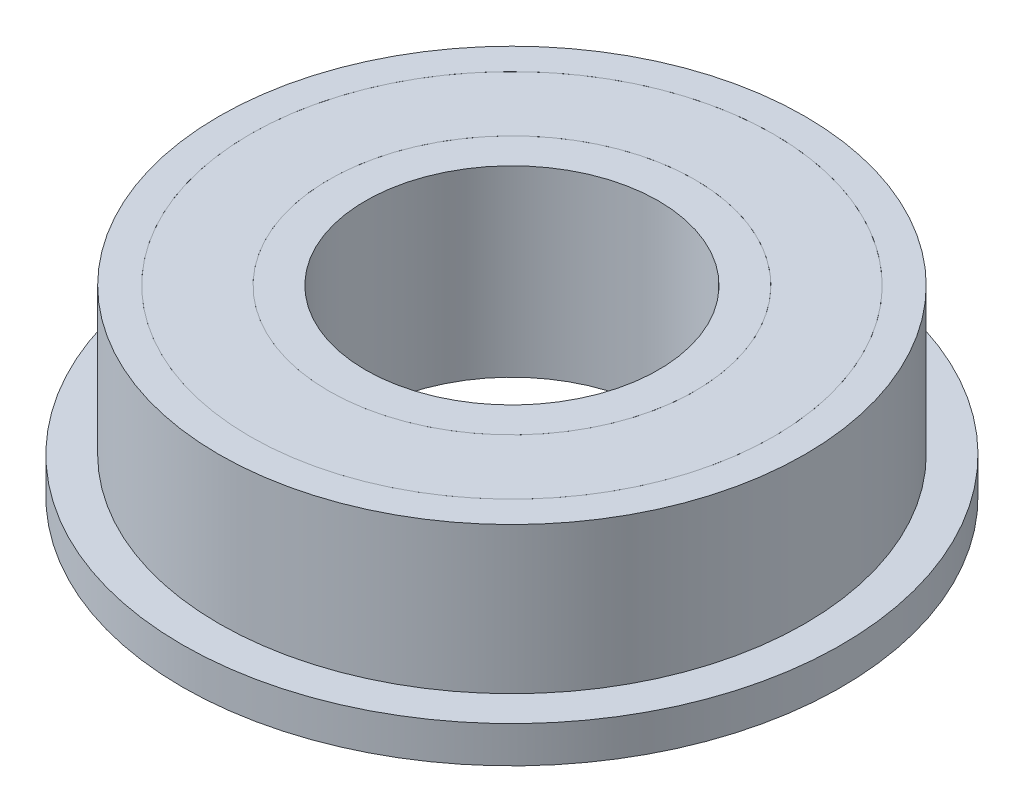
ISO-10303-21;
HEADER;
FILE_DESCRIPTION(('STEP AP214'),'2;1');
FILE_NAME('part.step','',(''),(''),'','','');
FILE_SCHEMA(('AUTOMOTIVE_DESIGN { 1 0 10303 214 1 1 1 1 }'));
ENDSEC;
DATA;
#1=APPLICATION_CONTEXT('core data for automotive mechanical design processes');
#2=APPLICATION_PROTOCOL_DEFINITION('international standard','automotive_design',2000,#1);
#3=PRODUCT_CONTEXT('',#1,'mechanical');
#4=PRODUCT('Part','Part','',(#3));
#5=PRODUCT_RELATED_PRODUCT_CATEGORY('part','',(#4));
#6=PRODUCT_DEFINITION_FORMATION('','',#4);
#7=PRODUCT_DEFINITION_CONTEXT('part definition',#1,'design');
#8=PRODUCT_DEFINITION('design','',#6,#7);
#9=PRODUCT_DEFINITION_SHAPE('','',#8);
#10=(LENGTH_UNIT() NAMED_UNIT(*) SI_UNIT(.MILLI.,.METRE.));
#11=(NAMED_UNIT(*) PLANE_ANGLE_UNIT() SI_UNIT($,.RADIAN.));
#12=(NAMED_UNIT(*) SI_UNIT($,.STERADIAN.) SOLID_ANGLE_UNIT());
#13=UNCERTAINTY_MEASURE_WITH_UNIT(LENGTH_MEASURE(1.E-05),#10,'distance_accuracy_value','');
#14=(GEOMETRIC_REPRESENTATION_CONTEXT(3) GLOBAL_UNCERTAINTY_ASSIGNED_CONTEXT((#13)) GLOBAL_UNIT_ASSIGNED_CONTEXT((#10,
#11,#12)) REPRESENTATION_CONTEXT('',''));
#15=CARTESIAN_POINT('',(0.,0.,0.));
#16=DIRECTION('',(0.,0.,1.));
#17=DIRECTION('',(1.,0.,0.));
#18=AXIS2_PLACEMENT_3D('',#15,#16,#17);
#19=CARTESIAN_POINT('',(0.,5.,0.));
#20=DIRECTION('',(0.,1.,0.));
#21=DIRECTION('',(0.,0.,1.));
#22=AXIS2_PLACEMENT_3D('',#19,#20,#21);
#23=PLANE('',#22);
#24=CARTESIAN_POINT('',(0.,5.,0.));
#25=DIRECTION('',(0.,1.,0.));
#26=DIRECTION('',(0.,0.,1.));
#27=AXIS2_PLACEMENT_3D('',#24,#25,#26);
#28=CIRCLE('',#27,4.);
#29=CARTESIAN_POINT('',(0.,5.,4.));
#30=VERTEX_POINT('',#29);
#31=EDGE_CURVE('E65',#30,#30,#28,.T.);
#32=ORIENTED_EDGE('',*,*,#31,.F.);
#33=EDGE_LOOP('',(#32));
#34=FACE_BOUND('',#33,.T.);
#35=CARTESIAN_POINT('',(0.,5.,0.));
#36=DIRECTION('',(0.,1.,0.));
#37=DIRECTION('',(0.,0.,1.));
#38=AXIS2_PLACEMENT_3D('',#35,#36,#37);
#39=CIRCLE('',#38,5.);
#40=CARTESIAN_POINT('',(0.,5.,5.));
#41=VERTEX_POINT('',#40);
#42=EDGE_CURVE('E11',#41,#41,#39,.F.);
#43=ORIENTED_EDGE('',*,*,#42,.F.);
#44=EDGE_LOOP('',(#43));
#45=FACE_BOUND('',#44,.T.);
#46=ADVANCED_FACE('F52',(#34,#45),#23,.T.);
#47=CARTESIAN_POINT('',(0.,0.,0.));
#48=DIRECTION('',(0.,-1.,0.));
#49=DIRECTION('',(0.,0.,-1.));
#50=AXIS2_PLACEMENT_3D('',#47,#48,#49);
#51=PLANE('',#50);
#52=CARTESIAN_POINT('',(0.,0.,0.));
#53=DIRECTION('',(0.,-1.,0.));
#54=DIRECTION('',(0.,0.,-1.));
#55=AXIS2_PLACEMENT_3D('',#52,#53,#54);
#56=CIRCLE('',#55,4.);
#57=CARTESIAN_POINT('',(0.,0.,-4.));
#58=VERTEX_POINT('',#57);
#59=EDGE_CURVE('E55',#58,#58,#56,.T.);
#60=ORIENTED_EDGE('',*,*,#59,.F.);
#61=EDGE_LOOP('',(#60));
#62=FACE_BOUND('',#61,.T.);
#63=CARTESIAN_POINT('',(0.,0.,0.));
#64=DIRECTION('',(0.,-1.,0.));
#65=DIRECTION('',(0.,0.,-1.));
#66=AXIS2_PLACEMENT_3D('',#63,#64,#65);
#67=CIRCLE('',#66,5.);
#68=CARTESIAN_POINT('',(0.,0.,-5.));
#69=VERTEX_POINT('',#68);
#70=EDGE_CURVE('E59',#69,#69,#67,.T.);
#71=ORIENTED_EDGE('',*,*,#70,.T.);
#72=EDGE_LOOP('',(#71));
#73=FACE_BOUND('',#72,.T.);
#74=ADVANCED_FACE('F74',(#62,#73),#51,.T.);
#75=CARTESIAN_POINT('',(0.,19.142135623731,0.));
#76=DIRECTION('',(0.,-1.,0.));
#77=DIRECTION('',(0.,0.,-1.));
#78=AXIS2_PLACEMENT_3D('',#75,#76,#77);
#79=CYLINDRICAL_SURFACE('',#78,5.);
#80=ORIENTED_EDGE('',*,*,#70,.F.);
#81=EDGE_LOOP('',(#80));
#82=FACE_BOUND('',#81,.T.);
#83=ORIENTED_EDGE('',*,*,#42,.T.);
#84=EDGE_LOOP('',(#83));
#85=FACE_BOUND('',#84,.T.);
#86=ADVANCED_FACE('F77',(#82,#85),#79,.T.);
#87=CARTESIAN_POINT('',(0.,-9.,0.));
#88=DIRECTION('',(0.,1.,0.));
#89=DIRECTION('',(0.,0.,1.));
#90=AXIS2_PLACEMENT_3D('',#87,#88,#89);
#91=CYLINDRICAL_SURFACE('',#90,4.);
#92=ORIENTED_EDGE('',*,*,#59,.T.);
#93=EDGE_LOOP('',(#92));
#94=FACE_BOUND('',#93,.T.);
#95=ORIENTED_EDGE('',*,*,#31,.T.);
#96=EDGE_LOOP('',(#95));
#97=FACE_BOUND('',#96,.T.);
#98=ADVANCED_FACE('F72',(#94,#97),#91,.F.);
#99=CLOSED_SHELL('',(#46,#74,#86,#98));
#100=MANIFOLD_SOLID_BREP('B2',#99);
#101=CARTESIAN_POINT('',(0.,5.,0.));
#102=DIRECTION('',(0.,1.,0.));
#103=DIRECTION('',(0.,0.,1.));
#104=AXIS2_PLACEMENT_3D('',#101,#102,#103);
#105=PLANE('',#104);
#106=CARTESIAN_POINT('',(0.,5.,0.));
#107=DIRECTION('',(0.,1.,0.));
#108=DIRECTION('',(0.,0.,1.));
#109=AXIS2_PLACEMENT_3D('',#106,#107,#108);
#110=CIRCLE('',#109,5.);
#111=CARTESIAN_POINT('',(0.,5.,5.));
#112=VERTEX_POINT('',#111);
#113=EDGE_CURVE('E150',#112,#112,#110,.T.);
#114=ORIENTED_EDGE('',*,*,#113,.F.);
#115=EDGE_LOOP('',(#114));
#116=FACE_BOUND('',#115,.T.);
#117=CARTESIAN_POINT('',(0.,5.,0.));
#118=DIRECTION('',(0.,1.,0.));
#119=DIRECTION('',(0.,0.,1.));
#120=AXIS2_PLACEMENT_3D('',#117,#118,#119);
#121=CIRCLE('',#120,7.15);
#122=CARTESIAN_POINT('',(0.,5.,7.15));
#123=VERTEX_POINT('',#122);
#124=EDGE_CURVE('E51',#123,#123,#121,.F.);
#125=ORIENTED_EDGE('',*,*,#124,.F.);
#126=EDGE_LOOP('',(#125));
#127=FACE_BOUND('',#126,.T.);
#128=ADVANCED_FACE('F135',(#116,#127),#105,.T.);
#129=CARTESIAN_POINT('',(0.,0.,0.));
#130=DIRECTION('',(0.,-1.,0.));
#131=DIRECTION('',(0.,0.,-1.));
#132=AXIS2_PLACEMENT_3D('',#129,#130,#131);
#133=PLANE('',#132);
#134=CARTESIAN_POINT('',(0.,0.,0.));
#135=DIRECTION('',(0.,-1.,0.));
#136=DIRECTION('',(0.,0.,-1.));
#137=AXIS2_PLACEMENT_3D('',#134,#135,#136);
#138=CIRCLE('',#137,5.);
#139=CARTESIAN_POINT('',(0.,0.,-5.));
#140=VERTEX_POINT('',#139);
#141=EDGE_CURVE('E138',#140,#140,#138,.T.);
#142=ORIENTED_EDGE('',*,*,#141,.F.);
#143=EDGE_LOOP('',(#142));
#144=FACE_BOUND('',#143,.T.);
#145=CARTESIAN_POINT('',(0.,0.,0.));
#146=DIRECTION('',(0.,-1.,0.));
#147=DIRECTION('',(0.,0.,-1.));
#148=AXIS2_PLACEMENT_3D('',#145,#146,#147);
#149=CIRCLE('',#148,7.15);
#150=CARTESIAN_POINT('',(0.,0.,-7.15));
#151=VERTEX_POINT('',#150);
#152=EDGE_CURVE('E143',#151,#151,#149,.T.);
#153=ORIENTED_EDGE('',*,*,#152,.T.);
#154=EDGE_LOOP('',(#153));
#155=FACE_BOUND('',#154,.T.);
#156=ADVANCED_FACE('F161',(#144,#155),#133,.T.);
#157=CARTESIAN_POINT('',(0.,25.2232539419353,0.));
#158=DIRECTION('',(0.,-1.,0.));
#159=DIRECTION('',(0.,0.,-1.));
#160=AXIS2_PLACEMENT_3D('',#157,#158,#159);
#161=CYLINDRICAL_SURFACE('',#160,7.15);
#162=ORIENTED_EDGE('',*,*,#152,.F.);
#163=EDGE_LOOP('',(#162));
#164=FACE_BOUND('',#163,.T.);
#165=ORIENTED_EDGE('',*,*,#124,.T.);
#166=EDGE_LOOP('',(#165));
#167=FACE_BOUND('',#166,.T.);
#168=ADVANCED_FACE('F164',(#164,#167),#161,.T.);
#169=CARTESIAN_POINT('',(0.,-9.,0.));
#170=DIRECTION('',(0.,1.,0.));
#171=DIRECTION('',(0.,0.,1.));
#172=AXIS2_PLACEMENT_3D('',#169,#170,#171);
#173=CYLINDRICAL_SURFACE('',#172,5.);
#174=ORIENTED_EDGE('',*,*,#141,.T.);
#175=EDGE_LOOP('',(#174));
#176=FACE_BOUND('',#175,.T.);
#177=ORIENTED_EDGE('',*,*,#113,.T.);
#178=EDGE_LOOP('',(#177));
#179=FACE_BOUND('',#178,.T.);
#180=ADVANCED_FACE('F159',(#176,#179),#173,.F.);
#181=CLOSED_SHELL('',(#128,#156,#168,#180));
#182=MANIFOLD_SOLID_BREP('B6',#181);
#183=CARTESIAN_POINT('',(0.,1.,0.));
#184=DIRECTION('',(0.,-1.,0.));
#185=DIRECTION('',(0.,0.,-1.));
#186=AXIS2_PLACEMENT_3D('',#183,#184,#185);
#187=CYLINDRICAL_SURFACE('',#186,9.);
#188=CARTESIAN_POINT('',(0.,1.,0.));
#189=DIRECTION('',(0.,1.,0.));
#190=DIRECTION('',(0.,0.,1.));
#191=AXIS2_PLACEMENT_3D('',#188,#189,#190);
#192=CIRCLE('',#191,9.);
#193=CARTESIAN_POINT('',(0.,1.,9.));
#194=VERTEX_POINT('',#193);
#195=EDGE_CURVE('E220',#194,#194,#192,.T.);
#196=ORIENTED_EDGE('',*,*,#195,.F.);
#197=EDGE_LOOP('',(#196));
#198=FACE_BOUND('',#197,.T.);
#199=CARTESIAN_POINT('',(0.,0.,0.));
#200=DIRECTION('',(0.,1.,0.));
#201=DIRECTION('',(0.,0.,1.));
#202=AXIS2_PLACEMENT_3D('',#199,#200,#201);
#203=CIRCLE('',#202,9.);
#204=CARTESIAN_POINT('',(0.,0.,9.));
#205=VERTEX_POINT('',#204);
#206=EDGE_CURVE('E216',#205,#205,#203,.T.);
#207=ORIENTED_EDGE('',*,*,#206,.T.);
#208=EDGE_LOOP('',(#207));
#209=FACE_BOUND('',#208,.T.);
#210=ADVANCED_FACE('F213',(#198,#209),#187,.T.);
#211=CARTESIAN_POINT('',(0.,1.,0.));
#212=DIRECTION('',(0.,1.,0.));
#213=DIRECTION('',(0.,0.,1.));
#214=AXIS2_PLACEMENT_3D('',#211,#212,#213);
#215=PLANE('',#214);
#216=CARTESIAN_POINT('',(0.,1.,0.));
#217=DIRECTION('',(0.,1.,0.));
#218=DIRECTION('',(0.,0.,1.));
#219=AXIS2_PLACEMENT_3D('',#216,#217,#218);
#220=CIRCLE('',#219,8.);
#221=CARTESIAN_POINT('',(0.,1.,8.));
#222=VERTEX_POINT('',#221);
#223=EDGE_CURVE('E134',#222,#222,#220,.T.);
#224=ORIENTED_EDGE('',*,*,#223,.F.);
#225=EDGE_LOOP('',(#224));
#226=FACE_BOUND('',#225,.T.);
#227=ORIENTED_EDGE('',*,*,#195,.T.);
#228=EDGE_LOOP('',(#227));
#229=FACE_BOUND('',#228,.T.);
#230=ADVANCED_FACE('F252',(#226,#229),#215,.T.);
#231=CARTESIAN_POINT('',(0.,0.,0.));
#232=DIRECTION('',(0.,1.,0.));
#233=DIRECTION('',(0.,0.,1.));
#234=AXIS2_PLACEMENT_3D('',#231,#232,#233);
#235=PLANE('',#234);
#236=CARTESIAN_POINT('',(0.,0.,0.));
#237=DIRECTION('',(0.,1.,0.));
#238=DIRECTION('',(0.,0.,1.));
#239=AXIS2_PLACEMENT_3D('',#236,#237,#238);
#240=CIRCLE('',#239,7.15);
#241=CARTESIAN_POINT('',(0.,0.,7.15));
#242=VERTEX_POINT('',#241);
#243=EDGE_CURVE('E229',#242,#242,#240,.T.);
#244=ORIENTED_EDGE('',*,*,#243,.T.);
#245=EDGE_LOOP('',(#244));
#246=FACE_BOUND('',#245,.T.);
#247=ORIENTED_EDGE('',*,*,#206,.F.);
#248=EDGE_LOOP('',(#247));
#249=FACE_BOUND('',#248,.T.);
#250=ADVANCED_FACE('F247',(#246,#249),#235,.F.);
#251=CARTESIAN_POINT('',(0.,5.,0.));
#252=DIRECTION('',(0.,-1.,0.));
#253=DIRECTION('',(0.,0.,-1.));
#254=AXIS2_PLACEMENT_3D('',#251,#252,#253);
#255=CYLINDRICAL_SURFACE('',#254,8.);
#256=CARTESIAN_POINT('',(0.,5.,0.));
#257=DIRECTION('',(0.,1.,0.));
#258=DIRECTION('',(0.,0.,1.));
#259=AXIS2_PLACEMENT_3D('',#256,#257,#258);
#260=CIRCLE('',#259,8.);
#261=CARTESIAN_POINT('',(0.,5.,8.));
#262=VERTEX_POINT('',#261);
#263=EDGE_CURVE('E226',#262,#262,#260,.T.);
#264=ORIENTED_EDGE('',*,*,#263,.F.);
#265=EDGE_LOOP('',(#264));
#266=FACE_BOUND('',#265,.T.);
#267=ORIENTED_EDGE('',*,*,#223,.T.);
#268=EDGE_LOOP('',(#267));
#269=FACE_BOUND('',#268,.T.);
#270=ADVANCED_FACE('F242',(#266,#269),#255,.T.);
#271=CARTESIAN_POINT('',(0.,5.,0.));
#272=DIRECTION('',(0.,1.,0.));
#273=DIRECTION('',(0.,0.,1.));
#274=AXIS2_PLACEMENT_3D('',#271,#272,#273);
#275=PLANE('',#274);
#276=CARTESIAN_POINT('',(0.,5.,0.));
#277=DIRECTION('',(0.,1.,0.));
#278=DIRECTION('',(0.,0.,1.));
#279=AXIS2_PLACEMENT_3D('',#276,#277,#278);
#280=CIRCLE('',#279,7.15);
#281=CARTESIAN_POINT('',(0.,5.,7.15));
#282=VERTEX_POINT('',#281);
#283=EDGE_CURVE('E232',#282,#282,#280,.T.);
#284=ORIENTED_EDGE('',*,*,#283,.F.);
#285=EDGE_LOOP('',(#284));
#286=FACE_BOUND('',#285,.T.);
#287=ORIENTED_EDGE('',*,*,#263,.T.);
#288=EDGE_LOOP('',(#287));
#289=FACE_BOUND('',#288,.T.);
#290=ADVANCED_FACE('F239',(#286,#289),#275,.T.);
#291=CARTESIAN_POINT('',(0.,-9.,0.));
#292=DIRECTION('',(0.,1.,0.));
#293=DIRECTION('',(0.,0.,1.));
#294=AXIS2_PLACEMENT_3D('',#291,#292,#293);
#295=CYLINDRICAL_SURFACE('',#294,7.15);
#296=ORIENTED_EDGE('',*,*,#283,.T.);
#297=EDGE_LOOP('',(#296));
#298=FACE_BOUND('',#297,.T.);
#299=ORIENTED_EDGE('',*,*,#243,.F.);
#300=EDGE_LOOP('',(#299));
#301=FACE_BOUND('',#300,.T.);
#302=ADVANCED_FACE('F236',(#298,#301),#295,.F.);
#303=CLOSED_SHELL('',(#210,#230,#250,#270,#290,#302));
#304=MANIFOLD_SOLID_BREP('B46',#303);
#305=ADVANCED_BREP_SHAPE_REPRESENTATION('',(#18,#100,#182,#304),#14);
#306=SHAPE_DEFINITION_REPRESENTATION(#9,#305);
ENDSEC;
END-ISO-10303-21;
